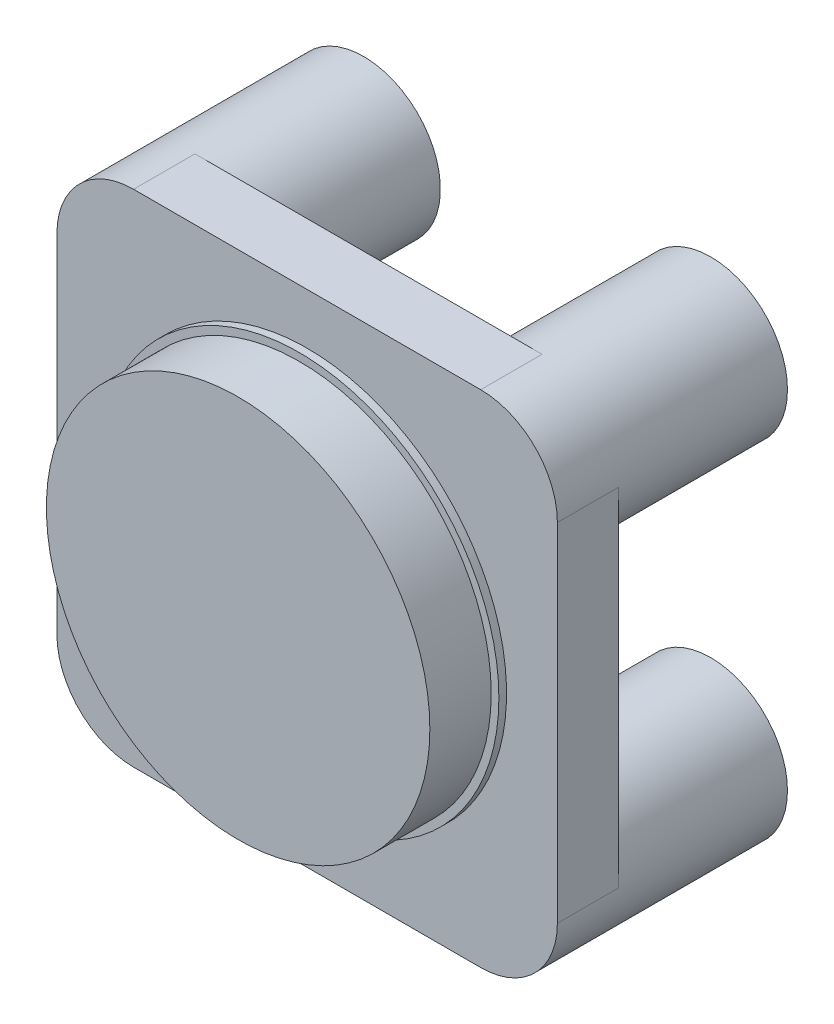
ISO-10303-21;
HEADER;
FILE_DESCRIPTION(('STEP AP214'),'2;1');
FILE_NAME('part.step','',(''),(''),'','','');
FILE_SCHEMA(('AUTOMOTIVE_DESIGN { 1 0 10303 214 1 1 1 1 }'));
ENDSEC;
DATA;
#1=APPLICATION_CONTEXT('core data for automotive mechanical design processes');
#2=APPLICATION_PROTOCOL_DEFINITION('international standard','automotive_design',2000,#1);
#3=PRODUCT_CONTEXT('',#1,'mechanical');
#4=PRODUCT('Part','Part','',(#3));
#5=PRODUCT_RELATED_PRODUCT_CATEGORY('part','',(#4));
#6=PRODUCT_DEFINITION_FORMATION('','',#4);
#7=PRODUCT_DEFINITION_CONTEXT('part definition',#1,'design');
#8=PRODUCT_DEFINITION('design','',#6,#7);
#9=PRODUCT_DEFINITION_SHAPE('','',#8);
#10=(LENGTH_UNIT() NAMED_UNIT(*) SI_UNIT(.MILLI.,.METRE.));
#11=(NAMED_UNIT(*) PLANE_ANGLE_UNIT() SI_UNIT($,.RADIAN.));
#12=(NAMED_UNIT(*) SI_UNIT($,.STERADIAN.) SOLID_ANGLE_UNIT());
#13=UNCERTAINTY_MEASURE_WITH_UNIT(LENGTH_MEASURE(1.E-05),#10,'distance_accuracy_value','');
#14=(GEOMETRIC_REPRESENTATION_CONTEXT(3) GLOBAL_UNCERTAINTY_ASSIGNED_CONTEXT((#13)) GLOBAL_UNIT_ASSIGNED_CONTEXT((#10,
#11,#12)) REPRESENTATION_CONTEXT('',''));
#15=CARTESIAN_POINT('',(0.,0.,0.));
#16=DIRECTION('',(0.,0.,1.));
#17=DIRECTION('',(1.,0.,0.));
#18=AXIS2_PLACEMENT_3D('',#15,#16,#17);
#19=CARTESIAN_POINT('',(11.3137084989848,11.3137084989848,19.));
#20=DIRECTION('',(0.,0.,-1.));
#21=DIRECTION('',(-1.,0.,0.));
#22=AXIS2_PLACEMENT_3D('',#19,#20,#21);
#23=PLANE('',#22);
#24=CARTESIAN_POINT('',(11.3137084989848,11.3137084989848,19.));
#25=DIRECTION('',(0.,0.,-1.));
#26=DIRECTION('',(-1.,0.,0.));
#27=AXIS2_PLACEMENT_3D('',#24,#25,#26);
#28=CIRCLE('',#27,5.);
#29=CARTESIAN_POINT('',(11.3137084989848,16.3137084989848,19.));
#30=VERTEX_POINT('',#29);
#31=CARTESIAN_POINT('',(16.3137084989848,11.3137084989848,19.));
#32=VERTEX_POINT('',#31);
#33=EDGE_CURVE('E160',#30,#32,#28,.T.);
#34=ORIENTED_EDGE('',*,*,#33,.F.);
#35=DIRECTION('',(-1.,0.,0.));
#36=VECTOR('',#35,1.);
#37=CARTESIAN_POINT('',(0.,16.3137084989848,19.));
#38=LINE('',#37,#36);
#39=CARTESIAN_POINT('',(-11.3137084989848,16.3137084989848,19.));
#40=VERTEX_POINT('',#39);
#41=EDGE_CURVE('E139',#30,#40,#38,.T.);
#42=ORIENTED_EDGE('',*,*,#41,.T.);
#43=CARTESIAN_POINT('',(-11.3137084989848,11.3137084989848,19.));
#44=DIRECTION('',(0.,0.,-1.));
#45=DIRECTION('',(-1.,0.,0.));
#46=AXIS2_PLACEMENT_3D('',#43,#44,#45);
#47=CIRCLE('',#46,5.);
#48=CARTESIAN_POINT('',(-16.3137084989848,11.3137084989848,19.));
#49=VERTEX_POINT('',#48);
#50=EDGE_CURVE('E136',#49,#40,#47,.T.);
#51=ORIENTED_EDGE('',*,*,#50,.F.);
#52=DIRECTION('',(0.,-1.,0.));
#53=VECTOR('',#52,1.);
#54=CARTESIAN_POINT('',(-16.3137084989848,0.,19.));
#55=LINE('',#54,#53);
#56=CARTESIAN_POINT('',(-16.3137084989848,-11.3137084989848,19.));
#57=VERTEX_POINT('',#56);
#58=EDGE_CURVE('E135',#49,#57,#55,.T.);
#59=ORIENTED_EDGE('',*,*,#58,.T.);
#60=CARTESIAN_POINT('',(-11.3137084989848,-11.3137084989848,19.));
#61=DIRECTION('',(0.,0.,-1.));
#62=DIRECTION('',(-1.,0.,0.));
#63=AXIS2_PLACEMENT_3D('',#60,#61,#62);
#64=CIRCLE('',#63,5.);
#65=CARTESIAN_POINT('',(-11.3137084989848,-16.3137084989848,19.));
#66=VERTEX_POINT('',#65);
#67=EDGE_CURVE('E172',#66,#57,#64,.T.);
#68=ORIENTED_EDGE('',*,*,#67,.F.);
#69=DIRECTION('',(1.,0.,0.));
#70=VECTOR('',#69,1.);
#71=CARTESIAN_POINT('',(0.,-16.3137084989848,19.));
#72=LINE('',#71,#70);
#73=CARTESIAN_POINT('',(11.3137084989848,-16.3137084989848,19.));
#74=VERTEX_POINT('',#73);
#75=EDGE_CURVE('E143',#66,#74,#72,.T.);
#76=ORIENTED_EDGE('',*,*,#75,.T.);
#77=CARTESIAN_POINT('',(11.3137084989848,-11.3137084989848,19.));
#78=DIRECTION('',(0.,0.,-1.));
#79=DIRECTION('',(-1.,0.,0.));
#80=AXIS2_PLACEMENT_3D('',#77,#78,#79);
#81=CIRCLE('',#80,5.);
#82=CARTESIAN_POINT('',(16.3137084989848,-11.3137084989848,19.));
#83=VERTEX_POINT('',#82);
#84=EDGE_CURVE('E166',#83,#74,#81,.T.);
#85=ORIENTED_EDGE('',*,*,#84,.F.);
#86=DIRECTION('',(0.,1.,0.));
#87=VECTOR('',#86,1.);
#88=CARTESIAN_POINT('',(16.3137084989848,0.,19.));
#89=LINE('',#88,#87);
#90=EDGE_CURVE('E117',#83,#32,#89,.T.);
#91=ORIENTED_EDGE('',*,*,#90,.T.);
#92=EDGE_LOOP('',(#34,#42,#51,#59,#68,#76,#85,#91));
#93=FACE_BOUND('',#92,.T.);
#94=CARTESIAN_POINT('',(0.,0.,19.));
#95=DIRECTION('',(0.,0.,-1.));
#96=DIRECTION('',(-1.,0.,0.));
#97=AXIS2_PLACEMENT_3D('',#94,#95,#96);
#98=CIRCLE('',#97,13.);
#99=CARTESIAN_POINT('',(-13.,0.,19.));
#100=VERTEX_POINT('',#99);
#101=EDGE_CURVE('E11',#100,#100,#98,.F.);
#102=ORIENTED_EDGE('',*,*,#101,.F.);
#103=EDGE_LOOP('',(#102));
#104=FACE_BOUND('',#103,.T.);
#105=ADVANCED_FACE('F41',(#93,#104),#23,.F.);
#106=CARTESIAN_POINT('',(11.3137084989848,11.3137084989848,4.));
#107=DIRECTION('',(0.,0.,1.));
#108=DIRECTION('',(1.,0.,0.));
#109=AXIS2_PLACEMENT_3D('',#106,#107,#108);
#110=CYLINDRICAL_SURFACE('',#109,5.);
#111=CARTESIAN_POINT('',(11.3137084989848,11.3137084989848,15.));
#112=DIRECTION('',(0.,0.,-1.));
#113=DIRECTION('',(-1.,0.,0.));
#114=AXIS2_PLACEMENT_3D('',#111,#112,#113);
#115=CIRCLE('',#114,5.);
#116=CARTESIAN_POINT('',(16.3137084989848,11.3137084989848,15.));
#117=VERTEX_POINT('',#116);
#118=CARTESIAN_POINT('',(11.3137084989848,16.3137084989848,15.));
#119=VERTEX_POINT('',#118);
#120=EDGE_CURVE('E56',#117,#119,#115,.T.);
#121=ORIENTED_EDGE('',*,*,#120,.T.);
#122=DIRECTION('',(0.,0.,1.));
#123=VECTOR('',#122,1.);
#124=CARTESIAN_POINT('',(11.3137084989848,16.3137084989848,15.));
#125=LINE('',#124,#123);
#126=EDGE_CURVE('E151',#119,#30,#125,.T.);
#127=ORIENTED_EDGE('',*,*,#126,.T.);
#128=ORIENTED_EDGE('',*,*,#33,.T.);
#129=DIRECTION('',(0.,0.,1.));
#130=VECTOR('',#129,1.);
#131=CARTESIAN_POINT('',(16.3137084989848,11.3137084989848,15.));
#132=LINE('',#131,#130);
#133=EDGE_CURVE('E61',#117,#32,#132,.T.);
#134=ORIENTED_EDGE('',*,*,#133,.F.);
#135=EDGE_LOOP('',(#121,#127,#128,#134));
#136=FACE_BOUND('',#135,.T.);
#137=CARTESIAN_POINT('',(11.3137084989848,11.3137084989848,4.));
#138=DIRECTION('',(0.,0.,-1.));
#139=DIRECTION('',(-1.,0.,0.));
#140=AXIS2_PLACEMENT_3D('',#137,#138,#139);
#141=CIRCLE('',#140,5.);
#142=CARTESIAN_POINT('',(6.31370849898476,11.3137084989848,4.));
#143=VERTEX_POINT('',#142);
#144=EDGE_CURVE('E49',#143,#143,#141,.T.);
#145=ORIENTED_EDGE('',*,*,#144,.F.);
#146=EDGE_LOOP('',(#145));
#147=FACE_BOUND('',#146,.T.);
#148=ADVANCED_FACE('F43',(#136,#147),#110,.T.);
#149=CARTESIAN_POINT('',(11.3137084989848,11.3137084989848,4.));
#150=DIRECTION('',(0.,0.,-1.));
#151=DIRECTION('',(-1.,0.,0.));
#152=AXIS2_PLACEMENT_3D('',#149,#150,#151);
#153=PLANE('',#152);
#154=ORIENTED_EDGE('',*,*,#144,.T.);
#155=EDGE_LOOP('',(#154));
#156=FACE_BOUND('',#155,.T.);
#157=ADVANCED_FACE('F217',(#156),#153,.T.);
#158=CARTESIAN_POINT('',(-16.3137084989848,0.,15.));
#159=DIRECTION('',(-1.,0.,0.));
#160=DIRECTION('',(0.,-1.,0.));
#161=AXIS2_PLACEMENT_3D('',#158,#159,#160);
#162=PLANE('',#161);
#163=ORIENTED_EDGE('',*,*,#58,.F.);
#164=DIRECTION('',(0.,0.,1.));
#165=VECTOR('',#164,1.);
#166=CARTESIAN_POINT('',(-16.3137084989848,11.3137084989848,15.));
#167=LINE('',#166,#165);
#168=CARTESIAN_POINT('',(-16.3137084989848,11.3137084989848,15.));
#169=VERTEX_POINT('',#168);
#170=EDGE_CURVE('E155',#169,#49,#167,.T.);
#171=ORIENTED_EDGE('',*,*,#170,.F.);
#172=DIRECTION('',(0.,-1.,0.));
#173=VECTOR('',#172,1.);
#174=CARTESIAN_POINT('',(-16.3137084989848,0.,15.));
#175=LINE('',#174,#173);
#176=CARTESIAN_POINT('',(-16.3137084989848,-11.3137084989848,15.));
#177=VERTEX_POINT('',#176);
#178=EDGE_CURVE('E192',#169,#177,#175,.T.);
#179=ORIENTED_EDGE('',*,*,#178,.T.);
#180=DIRECTION('',(0.,0.,1.));
#181=VECTOR('',#180,1.);
#182=CARTESIAN_POINT('',(-16.3137084989848,-11.3137084989848,15.));
#183=LINE('',#182,#181);
#184=EDGE_CURVE('E158',#177,#57,#183,.T.);
#185=ORIENTED_EDGE('',*,*,#184,.T.);
#186=EDGE_LOOP('',(#163,#171,#179,#185));
#187=FACE_BOUND('',#186,.T.);
#188=ADVANCED_FACE('F215',(#187),#162,.T.);
#189=CARTESIAN_POINT('',(0.,16.3137084989848,15.));
#190=DIRECTION('',(0.,1.,0.));
#191=DIRECTION('',(-1.,0.,0.));
#192=AXIS2_PLACEMENT_3D('',#189,#190,#191);
#193=PLANE('',#192);
#194=ORIENTED_EDGE('',*,*,#41,.F.);
#195=ORIENTED_EDGE('',*,*,#126,.F.);
#196=DIRECTION('',(-1.,0.,0.));
#197=VECTOR('',#196,1.);
#198=CARTESIAN_POINT('',(0.,16.3137084989848,15.));
#199=LINE('',#198,#197);
#200=CARTESIAN_POINT('',(-11.3137084989848,16.3137084989848,15.));
#201=VERTEX_POINT('',#200);
#202=EDGE_CURVE('E198',#119,#201,#199,.T.);
#203=ORIENTED_EDGE('',*,*,#202,.T.);
#204=DIRECTION('',(0.,0.,1.));
#205=VECTOR('',#204,1.);
#206=CARTESIAN_POINT('',(-11.3137084989848,16.3137084989848,15.));
#207=LINE('',#206,#205);
#208=EDGE_CURVE('E153',#201,#40,#207,.T.);
#209=ORIENTED_EDGE('',*,*,#208,.T.);
#210=EDGE_LOOP('',(#194,#195,#203,#209));
#211=FACE_BOUND('',#210,.T.);
#212=ADVANCED_FACE('F202',(#211),#193,.T.);
#213=CARTESIAN_POINT('',(16.3137084989848,0.,15.));
#214=DIRECTION('',(1.,0.,0.));
#215=DIRECTION('',(0.,1.,0.));
#216=AXIS2_PLACEMENT_3D('',#213,#214,#215);
#217=PLANE('',#216);
#218=ORIENTED_EDGE('',*,*,#90,.F.);
#219=DIRECTION('',(0.,0.,1.));
#220=VECTOR('',#219,1.);
#221=CARTESIAN_POINT('',(16.3137084989848,-11.3137084989848,15.));
#222=LINE('',#221,#220);
#223=CARTESIAN_POINT('',(16.3137084989848,-11.3137084989848,15.));
#224=VERTEX_POINT('',#223);
#225=EDGE_CURVE('E114',#224,#83,#222,.T.);
#226=ORIENTED_EDGE('',*,*,#225,.F.);
#227=DIRECTION('',(0.,1.,0.));
#228=VECTOR('',#227,1.);
#229=CARTESIAN_POINT('',(16.3137084989848,0.,15.));
#230=LINE('',#229,#228);
#231=EDGE_CURVE('E104',#224,#117,#230,.T.);
#232=ORIENTED_EDGE('',*,*,#231,.T.);
#233=ORIENTED_EDGE('',*,*,#133,.T.);
#234=EDGE_LOOP('',(#218,#226,#232,#233));
#235=FACE_BOUND('',#234,.T.);
#236=ADVANCED_FACE('F115',(#235),#217,.T.);
#237=CARTESIAN_POINT('',(0.,0.,15.));
#238=DIRECTION('',(0.,0.,1.));
#239=DIRECTION('',(1.,0.,0.));
#240=AXIS2_PLACEMENT_3D('',#237,#238,#239);
#241=CYLINDRICAL_SURFACE('',#240,7.575);
#242=CARTESIAN_POINT('',(0.,0.,15.));
#243=DIRECTION('',(0.,0.,-1.));
#244=DIRECTION('',(-1.,0.,0.));
#245=AXIS2_PLACEMENT_3D('',#242,#243,#244);
#246=CIRCLE('',#245,7.575);
#247=CARTESIAN_POINT('',(-7.575,0.,15.));
#248=VERTEX_POINT('',#247);
#249=EDGE_CURVE('E146',#248,#248,#246,.T.);
#250=ORIENTED_EDGE('',*,*,#249,.T.);
#251=EDGE_LOOP('',(#250));
#252=FACE_BOUND('',#251,.T.);
#253=CARTESIAN_POINT('',(0.,0.,19.));
#254=DIRECTION('',(0.,0.,-1.));
#255=DIRECTION('',(-1.,0.,0.));
#256=AXIS2_PLACEMENT_3D('',#253,#254,#255);
#257=CIRCLE('',#256,7.575);
#258=CARTESIAN_POINT('',(-7.575,0.,19.));
#259=VERTEX_POINT('',#258);
#260=EDGE_CURVE('E132',#259,#259,#257,.T.);
#261=ORIENTED_EDGE('',*,*,#260,.F.);
#262=EDGE_LOOP('',(#261));
#263=FACE_BOUND('',#262,.T.);
#264=ADVANCED_FACE('F233',(#252,#263),#241,.F.);
#265=CARTESIAN_POINT('',(0.,-16.3137084989848,15.));
#266=DIRECTION('',(0.,-1.,0.));
#267=DIRECTION('',(1.,0.,0.));
#268=AXIS2_PLACEMENT_3D('',#265,#266,#267);
#269=PLANE('',#268);
#270=ORIENTED_EDGE('',*,*,#75,.F.);
#271=DIRECTION('',(0.,0.,1.));
#272=VECTOR('',#271,1.);
#273=CARTESIAN_POINT('',(-11.3137084989848,-16.3137084989848,15.));
#274=LINE('',#273,#272);
#275=CARTESIAN_POINT('',(-11.3137084989848,-16.3137084989848,15.));
#276=VERTEX_POINT('',#275);
#277=EDGE_CURVE('E128',#276,#66,#274,.T.);
#278=ORIENTED_EDGE('',*,*,#277,.F.);
#279=DIRECTION('',(1.,0.,0.));
#280=VECTOR('',#279,1.);
#281=CARTESIAN_POINT('',(0.,-16.3137084989848,15.));
#282=LINE('',#281,#280);
#283=CARTESIAN_POINT('',(11.3137084989848,-16.3137084989848,15.));
#284=VERTEX_POINT('',#283);
#285=EDGE_CURVE('E126',#276,#284,#282,.T.);
#286=ORIENTED_EDGE('',*,*,#285,.T.);
#287=DIRECTION('',(0.,0.,1.));
#288=VECTOR('',#287,1.);
#289=CARTESIAN_POINT('',(11.3137084989848,-16.3137084989848,15.));
#290=LINE('',#289,#288);
#291=EDGE_CURVE('E121',#284,#74,#290,.T.);
#292=ORIENTED_EDGE('',*,*,#291,.T.);
#293=EDGE_LOOP('',(#270,#278,#286,#292));
#294=FACE_BOUND('',#293,.T.);
#295=ADVANCED_FACE('F214',(#294),#269,.T.);
#296=CARTESIAN_POINT('',(0.,0.,15.));
#297=DIRECTION('',(0.,0.,-1.));
#298=DIRECTION('',(-1.,0.,0.));
#299=AXIS2_PLACEMENT_3D('',#296,#297,#298);
#300=PLANE('',#299);
#301=ORIENTED_EDGE('',*,*,#249,.F.);
#302=EDGE_LOOP('',(#301));
#303=FACE_BOUND('',#302,.T.);
#304=CARTESIAN_POINT('',(-11.3137084989848,-11.3137084989848,15.));
#305=DIRECTION('',(0.,0.,-1.));
#306=DIRECTION('',(-1.,0.,0.));
#307=AXIS2_PLACEMENT_3D('',#304,#305,#306);
#308=CIRCLE('',#307,5.);
#309=EDGE_CURVE('E189',#177,#276,#308,.T.);
#310=ORIENTED_EDGE('',*,*,#309,.F.);
#311=ORIENTED_EDGE('',*,*,#178,.F.);
#312=CARTESIAN_POINT('',(-11.3137084989848,11.3137084989848,15.));
#313=DIRECTION('',(0.,0.,-1.));
#314=DIRECTION('',(-1.,0.,0.));
#315=AXIS2_PLACEMENT_3D('',#312,#313,#314);
#316=CIRCLE('',#315,5.);
#317=EDGE_CURVE('E195',#201,#169,#316,.T.);
#318=ORIENTED_EDGE('',*,*,#317,.F.);
#319=ORIENTED_EDGE('',*,*,#202,.F.);
#320=ORIENTED_EDGE('',*,*,#120,.F.);
#321=ORIENTED_EDGE('',*,*,#231,.F.);
#322=CARTESIAN_POINT('',(11.3137084989848,-11.3137084989848,15.));
#323=DIRECTION('',(0.,0.,-1.));
#324=DIRECTION('',(-1.,0.,0.));
#325=AXIS2_PLACEMENT_3D('',#322,#323,#324);
#326=CIRCLE('',#325,5.);
#327=EDGE_CURVE('E108',#284,#224,#326,.T.);
#328=ORIENTED_EDGE('',*,*,#327,.F.);
#329=ORIENTED_EDGE('',*,*,#285,.F.);
#330=EDGE_LOOP('',(#310,#311,#318,#319,#320,#321,#328,#329));
#331=FACE_BOUND('',#330,.T.);
#332=ADVANCED_FACE('F106',(#303,#331),#300,.T.);
#333=CARTESIAN_POINT('',(-11.3137084989848,11.3137084989848,4.));
#334=DIRECTION('',(0.,0.,1.));
#335=DIRECTION('',(1.,0.,0.));
#336=AXIS2_PLACEMENT_3D('',#333,#334,#335);
#337=CYLINDRICAL_SURFACE('',#336,5.);
#338=ORIENTED_EDGE('',*,*,#170,.T.);
#339=ORIENTED_EDGE('',*,*,#50,.T.);
#340=ORIENTED_EDGE('',*,*,#208,.F.);
#341=ORIENTED_EDGE('',*,*,#317,.T.);
#342=EDGE_LOOP('',(#338,#339,#340,#341));
#343=FACE_BOUND('',#342,.T.);
#344=CARTESIAN_POINT('',(-11.3137084989848,11.3137084989848,4.));
#345=DIRECTION('',(0.,0.,-1.));
#346=DIRECTION('',(-1.,0.,0.));
#347=AXIS2_PLACEMENT_3D('',#344,#345,#346);
#348=CIRCLE('',#347,5.);
#349=CARTESIAN_POINT('',(-16.3137084989848,11.3137084989848,4.));
#350=VERTEX_POINT('',#349);
#351=EDGE_CURVE('E181',#350,#350,#348,.T.);
#352=ORIENTED_EDGE('',*,*,#351,.F.);
#353=EDGE_LOOP('',(#352));
#354=FACE_BOUND('',#353,.T.);
#355=ADVANCED_FACE('F204',(#343,#354),#337,.T.);
#356=CARTESIAN_POINT('',(-11.3137084989848,11.3137084989848,4.));
#357=DIRECTION('',(0.,0.,-1.));
#358=DIRECTION('',(-1.,0.,0.));
#359=AXIS2_PLACEMENT_3D('',#356,#357,#358);
#360=PLANE('',#359);
#361=ORIENTED_EDGE('',*,*,#351,.T.);
#362=EDGE_LOOP('',(#361));
#363=FACE_BOUND('',#362,.T.);
#364=ADVANCED_FACE('F272',(#363),#360,.T.);
#365=CARTESIAN_POINT('',(-11.3137084989848,-11.3137084989848,4.));
#366=DIRECTION('',(0.,0.,1.));
#367=DIRECTION('',(1.,0.,0.));
#368=AXIS2_PLACEMENT_3D('',#365,#366,#367);
#369=CYLINDRICAL_SURFACE('',#368,5.);
#370=CARTESIAN_POINT('',(-11.3137084989848,-11.3137084989848,4.));
#371=DIRECTION('',(0.,0.,-1.));
#372=DIRECTION('',(-1.,0.,0.));
#373=AXIS2_PLACEMENT_3D('',#370,#371,#372);
#374=CIRCLE('',#373,5.);
#375=CARTESIAN_POINT('',(-16.3137084989848,-11.3137084989848,4.));
#376=VERTEX_POINT('',#375);
#377=EDGE_CURVE('E168',#376,#376,#374,.T.);
#378=ORIENTED_EDGE('',*,*,#377,.F.);
#379=EDGE_LOOP('',(#378));
#380=FACE_BOUND('',#379,.T.);
#381=ORIENTED_EDGE('',*,*,#67,.T.);
#382=ORIENTED_EDGE('',*,*,#184,.F.);
#383=ORIENTED_EDGE('',*,*,#309,.T.);
#384=ORIENTED_EDGE('',*,*,#277,.T.);
#385=EDGE_LOOP('',(#381,#382,#383,#384));
#386=FACE_BOUND('',#385,.T.);
#387=ADVANCED_FACE('F211',(#380,#386),#369,.T.);
#388=CARTESIAN_POINT('',(-11.3137084989848,-11.3137084989848,4.));
#389=DIRECTION('',(0.,0.,-1.));
#390=DIRECTION('',(-1.,0.,0.));
#391=AXIS2_PLACEMENT_3D('',#388,#389,#390);
#392=PLANE('',#391);
#393=ORIENTED_EDGE('',*,*,#377,.T.);
#394=EDGE_LOOP('',(#393));
#395=FACE_BOUND('',#394,.T.);
#396=ADVANCED_FACE('F268',(#395),#392,.T.);
#397=CARTESIAN_POINT('',(11.3137084989848,-11.3137084989848,4.));
#398=DIRECTION('',(0.,0.,1.));
#399=DIRECTION('',(1.,0.,0.));
#400=AXIS2_PLACEMENT_3D('',#397,#398,#399);
#401=CYLINDRICAL_SURFACE('',#400,5.);
#402=ORIENTED_EDGE('',*,*,#225,.T.);
#403=ORIENTED_EDGE('',*,*,#84,.T.);
#404=ORIENTED_EDGE('',*,*,#291,.F.);
#405=ORIENTED_EDGE('',*,*,#327,.T.);
#406=EDGE_LOOP('',(#402,#403,#404,#405));
#407=FACE_BOUND('',#406,.T.);
#408=CARTESIAN_POINT('',(11.3137084989848,-11.3137084989848,4.));
#409=DIRECTION('',(0.,0.,-1.));
#410=DIRECTION('',(-1.,0.,0.));
#411=AXIS2_PLACEMENT_3D('',#408,#409,#410);
#412=CIRCLE('',#411,5.);
#413=CARTESIAN_POINT('',(6.31370849898476,-11.3137084989848,4.));
#414=VERTEX_POINT('',#413);
#415=EDGE_CURVE('E169',#414,#414,#412,.T.);
#416=ORIENTED_EDGE('',*,*,#415,.F.);
#417=EDGE_LOOP('',(#416));
#418=FACE_BOUND('',#417,.T.);
#419=ADVANCED_FACE('F124',(#407,#418),#401,.T.);
#420=CARTESIAN_POINT('',(11.3137084989848,-11.3137084989848,4.));
#421=DIRECTION('',(0.,0.,-1.));
#422=DIRECTION('',(-1.,0.,0.));
#423=AXIS2_PLACEMENT_3D('',#420,#421,#422);
#424=PLANE('',#423);
#425=ORIENTED_EDGE('',*,*,#415,.T.);
#426=EDGE_LOOP('',(#425));
#427=FACE_BOUND('',#426,.T.);
#428=ADVANCED_FACE('F249',(#427),#424,.T.);
#429=CARTESIAN_POINT('',(0.,0.,19.));
#430=DIRECTION('',(0.,0.,1.));
#431=DIRECTION('',(1.,0.,0.));
#432=AXIS2_PLACEMENT_3D('',#429,#430,#431);
#433=PLANE('',#432);
#434=ORIENTED_EDGE('',*,*,#260,.T.);
#435=EDGE_LOOP('',(#434));
#436=FACE_BOUND('',#435,.T.);
#437=ADVANCED_FACE('F246',(#436),#433,.F.);
#438=CARTESIAN_POINT('',(0.,0.,19.5));
#439=DIRECTION('',(0.,0.,1.));
#440=DIRECTION('',(1.,0.,0.));
#441=AXIS2_PLACEMENT_3D('',#438,#439,#440);
#442=PLANE('',#441);
#443=CARTESIAN_POINT('',(0.,0.,19.5));
#444=DIRECTION('',(0.,0.,1.));
#445=DIRECTION('',(1.,0.,0.));
#446=AXIS2_PLACEMENT_3D('',#443,#444,#445);
#447=CIRCLE('',#446,13.);
#448=CARTESIAN_POINT('',(13.,0.,19.5));
#449=VERTEX_POINT('',#448);
#450=EDGE_CURVE('E381',#449,#449,#447,.T.);
#451=ORIENTED_EDGE('',*,*,#450,.T.);
#452=EDGE_LOOP('',(#451));
#453=FACE_BOUND('',#452,.T.);
#454=CARTESIAN_POINT('',(0.,0.,19.5));
#455=DIRECTION('',(0.,0.,1.));
#456=DIRECTION('',(1.,0.,0.));
#457=AXIS2_PLACEMENT_3D('',#454,#455,#456);
#458=CIRCLE('',#457,12.5);
#459=CARTESIAN_POINT('',(12.5,0.,19.5));
#460=VERTEX_POINT('',#459);
#461=EDGE_CURVE('E383',#460,#460,#458,.T.);
#462=ORIENTED_EDGE('',*,*,#461,.F.);
#463=EDGE_LOOP('',(#462));
#464=FACE_BOUND('',#463,.T.);
#465=ADVANCED_FACE('F248',(#453,#464),#442,.T.);
#466=CARTESIAN_POINT('',(0.,0.,19.5));
#467=DIRECTION('',(0.,0.,-1.));
#468=DIRECTION('',(-1.,0.,0.));
#469=AXIS2_PLACEMENT_3D('',#466,#467,#468);
#470=CYLINDRICAL_SURFACE('',#469,13.);
#471=ORIENTED_EDGE('',*,*,#450,.F.);
#472=EDGE_LOOP('',(#471));
#473=FACE_BOUND('',#472,.T.);
#474=ORIENTED_EDGE('',*,*,#101,.T.);
#475=EDGE_LOOP('',(#474));
#476=FACE_BOUND('',#475,.T.);
#477=ADVANCED_FACE('F254',(#473,#476),#470,.T.);
#478=CARTESIAN_POINT('',(0.,0.,23.5));
#479=DIRECTION('',(0.,0.,1.));
#480=DIRECTION('',(1.,0.,0.));
#481=AXIS2_PLACEMENT_3D('',#478,#479,#480);
#482=PLANE('',#481);
#483=CARTESIAN_POINT('',(0.,0.,23.5));
#484=DIRECTION('',(0.,0.,1.));
#485=DIRECTION('',(1.,0.,0.));
#486=AXIS2_PLACEMENT_3D('',#483,#484,#485);
#487=CIRCLE('',#486,12.5);
#488=CARTESIAN_POINT('',(12.5,0.,23.5));
#489=VERTEX_POINT('',#488);
#490=EDGE_CURVE('E175',#489,#489,#487,.T.);
#491=ORIENTED_EDGE('',*,*,#490,.T.);
#492=EDGE_LOOP('',(#491));
#493=FACE_BOUND('',#492,.T.);
#494=ADVANCED_FACE('F261',(#493),#482,.T.);
#495=CARTESIAN_POINT('',(0.,0.,23.5));
#496=DIRECTION('',(0.,0.,-1.));
#497=DIRECTION('',(-1.,0.,0.));
#498=AXIS2_PLACEMENT_3D('',#495,#496,#497);
#499=CYLINDRICAL_SURFACE('',#498,12.5);
#500=ORIENTED_EDGE('',*,*,#461,.T.);
#501=EDGE_LOOP('',(#500));
#502=FACE_BOUND('',#501,.T.);
#503=ORIENTED_EDGE('',*,*,#490,.F.);
#504=EDGE_LOOP('',(#503));
#505=FACE_BOUND('',#504,.T.);
#506=ADVANCED_FACE('F263',(#502,#505),#499,.T.);
#507=CLOSED_SHELL('',(#105,#148,#157,#188,#212,#236,#264,#295,#332,#355,#364,#387,#396,#419,
#428,#437,#465,#477,#494,#506));
#508=MANIFOLD_SOLID_BREP('B2',#507);
#509=ADVANCED_BREP_SHAPE_REPRESENTATION('',(#18,#508),#14);
#510=SHAPE_DEFINITION_REPRESENTATION(#9,#509);
ENDSEC;
END-ISO-10303-21;
